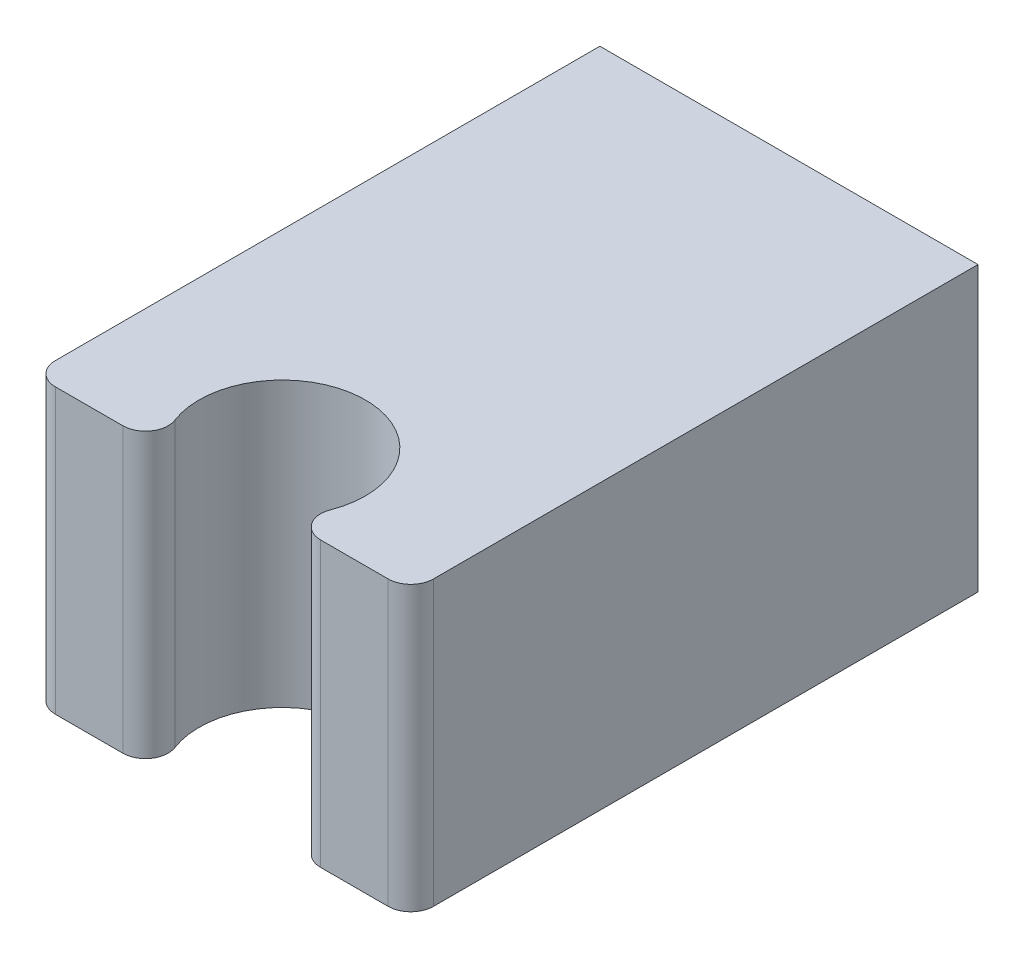
ISO-10303-21;
HEADER;
FILE_DESCRIPTION(('STEP AP214'),'2;1');
FILE_NAME('part.step','',(''),(''),'','','');
FILE_SCHEMA(('AUTOMOTIVE_DESIGN { 1 0 10303 214 1 1 1 1 }'));
ENDSEC;
DATA;
#1=APPLICATION_CONTEXT('core data for automotive mechanical design processes');
#2=APPLICATION_PROTOCOL_DEFINITION('international standard','automotive_design',2000,#1);
#3=PRODUCT_CONTEXT('',#1,'mechanical');
#4=PRODUCT('Part','Part','',(#3));
#5=PRODUCT_RELATED_PRODUCT_CATEGORY('part','',(#4));
#6=PRODUCT_DEFINITION_FORMATION('','',#4);
#7=PRODUCT_DEFINITION_CONTEXT('part definition',#1,'design');
#8=PRODUCT_DEFINITION('design','',#6,#7);
#9=PRODUCT_DEFINITION_SHAPE('','',#8);
#10=(LENGTH_UNIT() NAMED_UNIT(*) SI_UNIT(.MILLI.,.METRE.));
#11=(NAMED_UNIT(*) PLANE_ANGLE_UNIT() SI_UNIT($,.RADIAN.));
#12=(NAMED_UNIT(*) SI_UNIT($,.STERADIAN.) SOLID_ANGLE_UNIT());
#13=UNCERTAINTY_MEASURE_WITH_UNIT(LENGTH_MEASURE(1.E-05),#10,'distance_accuracy_value','');
#14=(GEOMETRIC_REPRESENTATION_CONTEXT(3) GLOBAL_UNCERTAINTY_ASSIGNED_CONTEXT((#13)) GLOBAL_UNIT_ASSIGNED_CONTEXT((#10,
#11,#12)) REPRESENTATION_CONTEXT('',''));
#15=CARTESIAN_POINT('',(0.,0.,0.));
#16=DIRECTION('',(0.,0.,1.));
#17=DIRECTION('',(1.,0.,0.));
#18=AXIS2_PLACEMENT_3D('',#15,#16,#17);
#19=CARTESIAN_POINT('',(0.,0.,10.));
#20=DIRECTION('',(0.,0.,1.));
#21=DIRECTION('',(1.,0.,0.));
#22=AXIS2_PLACEMENT_3D('',#19,#20,#21);
#23=PLANE('',#22);
#24=DIRECTION('',(-1.,0.,0.));
#25=VECTOR('',#24,1.);
#26=CARTESIAN_POINT('',(5.,-3.75,10.));
#27=LINE('',#26,#25);
#28=CARTESIAN_POINT('',(4.4,-3.75,10.));
#29=VERTEX_POINT('',#28);
#30=CARTESIAN_POINT('',(2.6153393661244,-3.75,10.));
#31=VERTEX_POINT('',#30);
#32=EDGE_CURVE('E148',#29,#31,#27,.T.);
#33=ORIENTED_EDGE('',*,*,#32,.F.);
#34=DIRECTION('',(0.,1.,0.));
#35=VECTOR('',#34,1.);
#36=CARTESIAN_POINT('',(4.4,0.,10.));
#37=LINE('',#36,#35);
#38=CARTESIAN_POINT('',(4.4,3.75,10.));
#39=VERTEX_POINT('',#38);
#40=EDGE_CURVE('E203',#29,#39,#37,.T.);
#41=ORIENTED_EDGE('',*,*,#40,.T.);
#42=DIRECTION('',(-1.,0.,0.));
#43=VECTOR('',#42,1.);
#44=CARTESIAN_POINT('',(5.,3.75,10.));
#45=LINE('',#44,#43);
#46=CARTESIAN_POINT('',(2.6153393661244,3.75,10.));
#47=VERTEX_POINT('',#46);
#48=EDGE_CURVE('E231',#39,#47,#45,.T.);
#49=ORIENTED_EDGE('',*,*,#48,.T.);
#50=DIRECTION('',(0.,-1.,0.));
#51=VECTOR('',#50,1.);
#52=CARTESIAN_POINT('',(2.6153393661244,-3.75,10.));
#53=LINE('',#52,#51);
#54=EDGE_CURVE('E200',#47,#31,#53,.T.);
#55=ORIENTED_EDGE('',*,*,#54,.T.);
#56=EDGE_LOOP('',(#33,#41,#49,#55));
#57=FACE_BOUND('',#56,.T.);
#58=ADVANCED_FACE('F45',(#57),#23,.T.);
#59=CARTESIAN_POINT('',(5.,-3.75,-5.));
#60=DIRECTION('',(1.,0.,0.));
#61=DIRECTION('',(0.,0.,-1.));
#62=AXIS2_PLACEMENT_3D('',#59,#60,#61);
#63=PLANE('',#62);
#64=DIRECTION('',(0.,0.,1.));
#65=VECTOR('',#64,1.);
#66=CARTESIAN_POINT('',(5.,3.75,-5.));
#67=LINE('',#66,#65);
#68=CARTESIAN_POINT('',(5.,3.75,-5.));
#69=VERTEX_POINT('',#68);
#70=CARTESIAN_POINT('',(5.,3.75,9.4));
#71=VERTEX_POINT('',#70);
#72=EDGE_CURVE('E123',#69,#71,#67,.T.);
#73=ORIENTED_EDGE('',*,*,#72,.T.);
#74=DIRECTION('',(0.,1.,0.));
#75=VECTOR('',#74,1.);
#76=CARTESIAN_POINT('',(5.,-3.75,9.4));
#77=LINE('',#76,#75);
#78=CARTESIAN_POINT('',(5.,-3.75,9.4));
#79=VERTEX_POINT('',#78);
#80=EDGE_CURVE('E61',#71,#79,#77,.F.);
#81=ORIENTED_EDGE('',*,*,#80,.T.);
#82=DIRECTION('',(0.,0.,1.));
#83=VECTOR('',#82,1.);
#84=CARTESIAN_POINT('',(5.,-3.75,-5.));
#85=LINE('',#84,#83);
#86=CARTESIAN_POINT('',(5.,-3.75,-5.));
#87=VERTEX_POINT('',#86);
#88=EDGE_CURVE('E145',#87,#79,#85,.T.);
#89=ORIENTED_EDGE('',*,*,#88,.F.);
#90=DIRECTION('',(0.,1.,0.));
#91=VECTOR('',#90,1.);
#92=CARTESIAN_POINT('',(5.,-3.75,-5.));
#93=LINE('',#92,#91);
#94=EDGE_CURVE('E138',#87,#69,#93,.T.);
#95=ORIENTED_EDGE('',*,*,#94,.T.);
#96=EDGE_LOOP('',(#73,#81,#89,#95));
#97=FACE_BOUND('',#96,.T.);
#98=ADVANCED_FACE('F144',(#97),#63,.T.);
#99=CARTESIAN_POINT('',(5.,-3.75,-5.));
#100=DIRECTION('',(0.,1.,0.));
#101=DIRECTION('',(0.,0.,1.));
#102=AXIS2_PLACEMENT_3D('',#99,#100,#101);
#103=PLANE('',#102);
#104=CARTESIAN_POINT('',(-2.6153393661244,-3.75,10.));
#105=VERTEX_POINT('',#104);
#106=CARTESIAN_POINT('',(-4.4,-3.75,10.));
#107=VERTEX_POINT('',#106);
#108=EDGE_CURVE('E152',#105,#107,#27,.T.);
#109=ORIENTED_EDGE('',*,*,#108,.T.);
#110=CARTESIAN_POINT('',(-4.4,-3.75,9.4));
#111=DIRECTION('',(0.,1.,0.));
#112=DIRECTION('',(0.,0.,1.));
#113=AXIS2_PLACEMENT_3D('',#110,#111,#112);
#114=CIRCLE('',#113,0.6);
#115=CARTESIAN_POINT('',(-5.,-3.75,9.4));
#116=VERTEX_POINT('',#115);
#117=EDGE_CURVE('E197',#107,#116,#114,.F.);
#118=ORIENTED_EDGE('',*,*,#117,.T.);
#119=DIRECTION('',(0.,0.,1.));
#120=VECTOR('',#119,1.);
#121=CARTESIAN_POINT('',(-5.,-3.75,-5.));
#122=LINE('',#121,#120);
#123=CARTESIAN_POINT('',(-5.,-3.75,-5.));
#124=VERTEX_POINT('',#123);
#125=EDGE_CURVE('E163',#124,#116,#122,.T.);
#126=ORIENTED_EDGE('',*,*,#125,.F.);
#127=DIRECTION('',(-1.,0.,0.));
#128=VECTOR('',#127,1.);
#129=CARTESIAN_POINT('',(5.,-3.75,-5.));
#130=LINE('',#129,#128);
#131=EDGE_CURVE('E133',#87,#124,#130,.T.);
#132=ORIENTED_EDGE('',*,*,#131,.F.);
#133=ORIENTED_EDGE('',*,*,#88,.T.);
#134=CARTESIAN_POINT('',(4.4,-3.75,9.4));
#135=DIRECTION('',(0.,1.,0.));
#136=DIRECTION('',(0.,0.,1.));
#137=AXIS2_PLACEMENT_3D('',#134,#135,#136);
#138=CIRCLE('',#137,0.6);
#139=EDGE_CURVE('E194',#79,#29,#138,.F.);
#140=ORIENTED_EDGE('',*,*,#139,.T.);
#141=ORIENTED_EDGE('',*,*,#32,.T.);
#142=CARTESIAN_POINT('',(2.6153393661244,-3.75,9.4));
#143=DIRECTION('',(0.,1.,0.));
#144=DIRECTION('',(0.,0.,1.));
#145=AXIS2_PLACEMENT_3D('',#142,#143,#144);
#146=CIRCLE('',#145,0.6);
#147=CARTESIAN_POINT('',(2.05490950195489,-3.75,9.18571428571429));
#148=VERTEX_POINT('',#147);
#149=EDGE_CURVE('E189',#31,#148,#146,.F.);
#150=ORIENTED_EDGE('',*,*,#149,.T.);
#151=CARTESIAN_POINT('',(0.,-3.75,8.4));
#152=DIRECTION('',(0.,1.,0.));
#153=DIRECTION('',(0.,0.,1.));
#154=AXIS2_PLACEMENT_3D('',#151,#152,#153);
#155=CIRCLE('',#154,2.2);
#156=CARTESIAN_POINT('',(-2.05490950195489,-3.75,9.18571428571429));
#157=VERTEX_POINT('',#156);
#158=EDGE_CURVE('E218',#148,#157,#155,.T.);
#159=ORIENTED_EDGE('',*,*,#158,.T.);
#160=CARTESIAN_POINT('',(-2.6153393661244,-3.75,9.4));
#161=DIRECTION('',(0.,1.,0.));
#162=DIRECTION('',(0.,0.,1.));
#163=AXIS2_PLACEMENT_3D('',#160,#161,#162);
#164=CIRCLE('',#163,0.6);
#165=EDGE_CURVE('E69',#157,#105,#164,.F.);
#166=ORIENTED_EDGE('',*,*,#165,.T.);
#167=EDGE_LOOP('',(#109,#118,#126,#132,#133,#140,#141,#150,#159,#166));
#168=FACE_BOUND('',#167,.T.);
#169=ADVANCED_FACE('F242',(#168),#103,.F.);
#170=CARTESIAN_POINT('',(-5.,-3.75,-5.));
#171=DIRECTION('',(1.,0.,0.));
#172=DIRECTION('',(0.,0.,-1.));
#173=AXIS2_PLACEMENT_3D('',#170,#171,#172);
#174=PLANE('',#173);
#175=ORIENTED_EDGE('',*,*,#125,.T.);
#176=DIRECTION('',(0.,1.,0.));
#177=VECTOR('',#176,1.);
#178=CARTESIAN_POINT('',(-5.,3.75,9.4));
#179=LINE('',#178,#177);
#180=CARTESIAN_POINT('',(-5.,3.75,9.4));
#181=VERTEX_POINT('',#180);
#182=EDGE_CURVE('E162',#116,#181,#179,.T.);
#183=ORIENTED_EDGE('',*,*,#182,.T.);
#184=DIRECTION('',(0.,0.,1.));
#185=VECTOR('',#184,1.);
#186=CARTESIAN_POINT('',(-5.,3.75,-5.));
#187=LINE('',#186,#185);
#188=CARTESIAN_POINT('',(-5.,3.75,-5.));
#189=VERTEX_POINT('',#188);
#190=EDGE_CURVE('E132',#189,#181,#187,.T.);
#191=ORIENTED_EDGE('',*,*,#190,.F.);
#192=DIRECTION('',(0.,1.,0.));
#193=VECTOR('',#192,1.);
#194=CARTESIAN_POINT('',(-5.,-3.75,-5.));
#195=LINE('',#194,#193);
#196=EDGE_CURVE('E140',#124,#189,#195,.T.);
#197=ORIENTED_EDGE('',*,*,#196,.F.);
#198=EDGE_LOOP('',(#175,#183,#191,#197));
#199=FACE_BOUND('',#198,.T.);
#200=ADVANCED_FACE('F248',(#199),#174,.F.);
#201=CARTESIAN_POINT('',(5.,3.75,-5.));
#202=DIRECTION('',(0.,1.,0.));
#203=DIRECTION('',(0.,0.,1.));
#204=AXIS2_PLACEMENT_3D('',#201,#202,#203);
#205=PLANE('',#204);
#206=ORIENTED_EDGE('',*,*,#190,.T.);
#207=CARTESIAN_POINT('',(-4.4,3.75,9.4));
#208=DIRECTION('',(0.,1.,0.));
#209=DIRECTION('',(0.,0.,1.));
#210=AXIS2_PLACEMENT_3D('',#207,#208,#209);
#211=CIRCLE('',#210,0.6);
#212=CARTESIAN_POINT('',(-4.4,3.75,10.));
#213=VERTEX_POINT('',#212);
#214=EDGE_CURVE('E180',#181,#213,#211,.T.);
#215=ORIENTED_EDGE('',*,*,#214,.T.);
#216=CARTESIAN_POINT('',(-2.6153393661244,3.75,10.));
#217=VERTEX_POINT('',#216);
#218=EDGE_CURVE('E227',#217,#213,#45,.T.);
#219=ORIENTED_EDGE('',*,*,#218,.F.);
#220=CARTESIAN_POINT('',(-2.6153393661244,3.75,9.4));
#221=DIRECTION('',(0.,1.,0.));
#222=DIRECTION('',(0.,0.,1.));
#223=AXIS2_PLACEMENT_3D('',#220,#221,#222);
#224=CIRCLE('',#223,0.6);
#225=CARTESIAN_POINT('',(-2.05490950195489,3.75,9.18571428571429));
#226=VERTEX_POINT('',#225);
#227=EDGE_CURVE('E175',#217,#226,#224,.T.);
#228=ORIENTED_EDGE('',*,*,#227,.T.);
#229=CARTESIAN_POINT('',(0.,3.75,8.4));
#230=DIRECTION('',(0.,1.,0.));
#231=DIRECTION('',(0.,0.,1.));
#232=AXIS2_PLACEMENT_3D('',#229,#230,#231);
#233=CIRCLE('',#232,2.2);
#234=CARTESIAN_POINT('',(2.05490950195489,3.75,9.18571428571429));
#235=VERTEX_POINT('',#234);
#236=EDGE_CURVE('E216',#235,#226,#233,.T.);
#237=ORIENTED_EDGE('',*,*,#236,.F.);
#238=CARTESIAN_POINT('',(2.6153393661244,3.75,9.4));
#239=DIRECTION('',(0.,1.,0.));
#240=DIRECTION('',(0.,0.,1.));
#241=AXIS2_PLACEMENT_3D('',#238,#239,#240);
#242=CIRCLE('',#241,0.6);
#243=EDGE_CURVE('E172',#235,#47,#242,.T.);
#244=ORIENTED_EDGE('',*,*,#243,.T.);
#245=ORIENTED_EDGE('',*,*,#48,.F.);
#246=CARTESIAN_POINT('',(4.4,3.75,9.4));
#247=DIRECTION('',(0.,1.,0.));
#248=DIRECTION('',(0.,0.,1.));
#249=AXIS2_PLACEMENT_3D('',#246,#247,#248);
#250=CIRCLE('',#249,0.6);
#251=EDGE_CURVE('E129',#39,#71,#250,.T.);
#252=ORIENTED_EDGE('',*,*,#251,.T.);
#253=ORIENTED_EDGE('',*,*,#72,.F.);
#254=DIRECTION('',(-1.,0.,0.));
#255=VECTOR('',#254,1.);
#256=CARTESIAN_POINT('',(5.,3.75,-5.));
#257=LINE('',#256,#255);
#258=EDGE_CURVE('E127',#69,#189,#257,.T.);
#259=ORIENTED_EDGE('',*,*,#258,.T.);
#260=EDGE_LOOP('',(#206,#215,#219,#228,#237,#244,#245,#252,#253,#259));
#261=FACE_BOUND('',#260,.T.);
#262=ADVANCED_FACE('F126',(#261),#205,.T.);
#263=CARTESIAN_POINT('',(0.,0.,-5.));
#264=DIRECTION('',(0.,0.,1.));
#265=DIRECTION('',(1.,0.,0.));
#266=AXIS2_PLACEMENT_3D('',#263,#264,#265);
#267=PLANE('',#266);
#268=ORIENTED_EDGE('',*,*,#94,.F.);
#269=ORIENTED_EDGE('',*,*,#131,.T.);
#270=ORIENTED_EDGE('',*,*,#196,.T.);
#271=ORIENTED_EDGE('',*,*,#258,.F.);
#272=EDGE_LOOP('',(#268,#269,#270,#271));
#273=FACE_BOUND('',#272,.T.);
#274=ADVANCED_FACE('F137',(#273),#267,.F.);
#275=ORIENTED_EDGE('',*,*,#218,.T.);
#276=DIRECTION('',(0.,1.,0.));
#277=VECTOR('',#276,1.);
#278=CARTESIAN_POINT('',(-4.4,-3.75,10.));
#279=LINE('',#278,#277);
#280=EDGE_CURVE('E186',#213,#107,#279,.F.);
#281=ORIENTED_EDGE('',*,*,#280,.T.);
#282=ORIENTED_EDGE('',*,*,#108,.F.);
#283=DIRECTION('',(0.,-1.,0.));
#284=VECTOR('',#283,1.);
#285=CARTESIAN_POINT('',(-2.6153393661244,3.75,10.));
#286=LINE('',#285,#284);
#287=EDGE_CURVE('E183',#105,#217,#286,.F.);
#288=ORIENTED_EDGE('',*,*,#287,.T.);
#289=EDGE_LOOP('',(#275,#281,#282,#288));
#290=FACE_BOUND('',#289,.T.);
#291=ADVANCED_FACE('F264',(#290),#23,.T.);
#292=CARTESIAN_POINT('',(0.,-3.75,8.4));
#293=DIRECTION('',(0.,1.,0.));
#294=DIRECTION('',(0.,0.,1.));
#295=AXIS2_PLACEMENT_3D('',#292,#293,#294);
#296=CYLINDRICAL_SURFACE('',#295,2.2);
#297=ORIENTED_EDGE('',*,*,#236,.T.);
#298=DIRECTION('',(0.,1.,0.));
#299=VECTOR('',#298,1.);
#300=CARTESIAN_POINT('',(-2.05490950195489,-3.75,9.18571428571429));
#301=LINE('',#300,#299);
#302=EDGE_CURVE('E11',#226,#157,#301,.F.);
#303=ORIENTED_EDGE('',*,*,#302,.T.);
#304=ORIENTED_EDGE('',*,*,#158,.F.);
#305=DIRECTION('',(0.,1.,0.));
#306=VECTOR('',#305,1.);
#307=CARTESIAN_POINT('',(2.05490950195489,-3.75,9.18571428571429));
#308=LINE('',#307,#306);
#309=EDGE_CURVE('E54',#148,#235,#308,.T.);
#310=ORIENTED_EDGE('',*,*,#309,.T.);
#311=EDGE_LOOP('',(#297,#303,#304,#310));
#312=FACE_BOUND('',#311,.T.);
#313=ADVANCED_FACE('F215',(#312),#296,.F.);
#314=CARTESIAN_POINT('',(-4.4,-3.75,9.4));
#315=DIRECTION('',(0.,-1.,0.));
#316=DIRECTION('',(0.,0.,-1.));
#317=AXIS2_PLACEMENT_3D('',#314,#315,#316);
#318=CYLINDRICAL_SURFACE('',#317,0.6);
#319=ORIENTED_EDGE('',*,*,#117,.F.);
#320=ORIENTED_EDGE('',*,*,#280,.F.);
#321=ORIENTED_EDGE('',*,*,#214,.F.);
#322=ORIENTED_EDGE('',*,*,#182,.F.);
#323=EDGE_LOOP('',(#319,#320,#321,#322));
#324=FACE_BOUND('',#323,.T.);
#325=ADVANCED_FACE('F246',(#324),#318,.T.);
#326=CARTESIAN_POINT('',(4.4,0.,9.4));
#327=DIRECTION('',(0.,1.,0.));
#328=DIRECTION('',(0.,0.,1.));
#329=AXIS2_PLACEMENT_3D('',#326,#327,#328);
#330=CYLINDRICAL_SURFACE('',#329,0.6);
#331=ORIENTED_EDGE('',*,*,#139,.F.);
#332=ORIENTED_EDGE('',*,*,#80,.F.);
#333=ORIENTED_EDGE('',*,*,#251,.F.);
#334=ORIENTED_EDGE('',*,*,#40,.F.);
#335=EDGE_LOOP('',(#331,#332,#333,#334));
#336=FACE_BOUND('',#335,.T.);
#337=ADVANCED_FACE('F254',(#336),#330,.T.);
#338=CARTESIAN_POINT('',(-2.6153393661244,-3.75,9.4));
#339=DIRECTION('',(0.,1.,0.));
#340=DIRECTION('',(0.,0.,1.));
#341=AXIS2_PLACEMENT_3D('',#338,#339,#340);
#342=CYLINDRICAL_SURFACE('',#341,0.6);
#343=ORIENTED_EDGE('',*,*,#227,.F.);
#344=ORIENTED_EDGE('',*,*,#287,.F.);
#345=ORIENTED_EDGE('',*,*,#165,.F.);
#346=ORIENTED_EDGE('',*,*,#302,.F.);
#347=EDGE_LOOP('',(#343,#344,#345,#346));
#348=FACE_BOUND('',#347,.T.);
#349=ADVANCED_FACE('F249',(#348),#342,.T.);
#350=CARTESIAN_POINT('',(2.6153393661244,-3.75,9.4));
#351=DIRECTION('',(0.,1.,0.));
#352=DIRECTION('',(0.,0.,1.));
#353=AXIS2_PLACEMENT_3D('',#350,#351,#352);
#354=CYLINDRICAL_SURFACE('',#353,0.6);
#355=ORIENTED_EDGE('',*,*,#149,.F.);
#356=ORIENTED_EDGE('',*,*,#54,.F.);
#357=ORIENTED_EDGE('',*,*,#243,.F.);
#358=ORIENTED_EDGE('',*,*,#309,.F.);
#359=EDGE_LOOP('',(#355,#356,#357,#358));
#360=FACE_BOUND('',#359,.T.);
#361=ADVANCED_FACE('F47',(#360),#354,.T.);
#362=CLOSED_SHELL('',(#58,#98,#169,#200,#262,#274,#291,#313,#325,#337,#349,#361));
#363=MANIFOLD_SOLID_BREP('B2',#362);
#364=ADVANCED_BREP_SHAPE_REPRESENTATION('',(#18,#363),#14);
#365=SHAPE_DEFINITION_REPRESENTATION(#9,#364);
ENDSEC;
END-ISO-10303-21;
